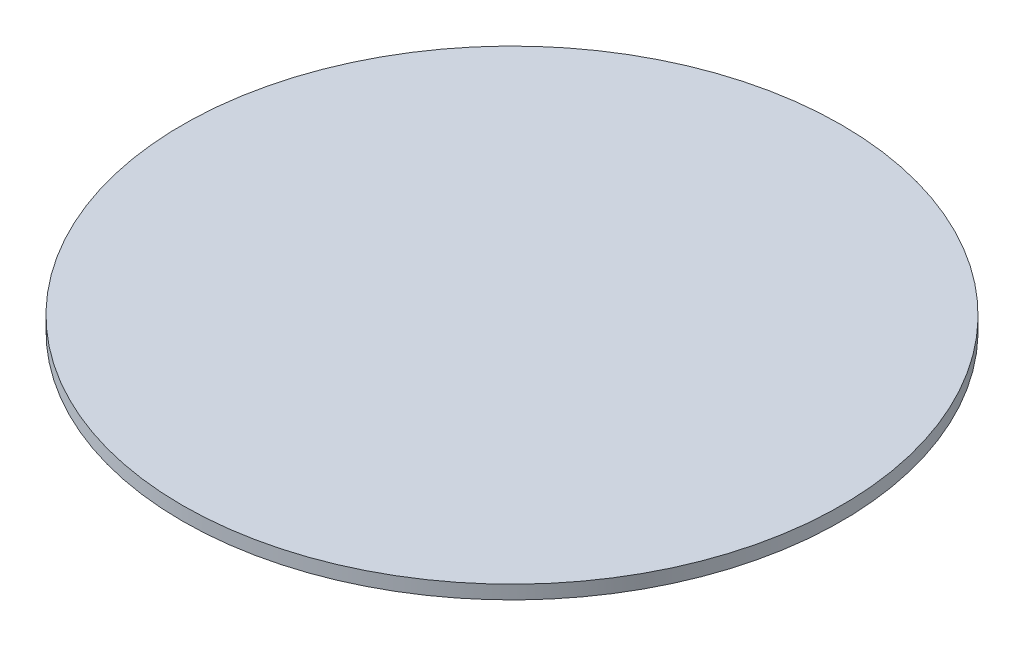
ISO-10303-21;
HEADER;
FILE_DESCRIPTION(('STEP AP214'),'2;1');
FILE_NAME('part.step','',(''),(''),'','','');
FILE_SCHEMA(('AUTOMOTIVE_DESIGN { 1 0 10303 214 1 1 1 1 }'));
ENDSEC;
DATA;
#1=APPLICATION_CONTEXT('core data for automotive mechanical design processes');
#2=APPLICATION_PROTOCOL_DEFINITION('international standard','automotive_design',2000,#1);
#3=PRODUCT_CONTEXT('',#1,'mechanical');
#4=PRODUCT('Part','Part','',(#3));
#5=PRODUCT_RELATED_PRODUCT_CATEGORY('part','',(#4));
#6=PRODUCT_DEFINITION_FORMATION('','',#4);
#7=PRODUCT_DEFINITION_CONTEXT('part definition',#1,'design');
#8=PRODUCT_DEFINITION('design','',#6,#7);
#9=PRODUCT_DEFINITION_SHAPE('','',#8);
#10=(LENGTH_UNIT() NAMED_UNIT(*) SI_UNIT(.MILLI.,.METRE.));
#11=(NAMED_UNIT(*) PLANE_ANGLE_UNIT() SI_UNIT($,.RADIAN.));
#12=(NAMED_UNIT(*) SI_UNIT($,.STERADIAN.) SOLID_ANGLE_UNIT());
#13=UNCERTAINTY_MEASURE_WITH_UNIT(LENGTH_MEASURE(1.E-05),#10,'distance_accuracy_value','');
#14=(GEOMETRIC_REPRESENTATION_CONTEXT(3) GLOBAL_UNCERTAINTY_ASSIGNED_CONTEXT((#13)) GLOBAL_UNIT_ASSIGNED_CONTEXT((#10,
#11,#12)) REPRESENTATION_CONTEXT('',''));
#15=CARTESIAN_POINT('',(0.,0.,0.));
#16=DIRECTION('',(0.,0.,1.));
#17=DIRECTION('',(1.,0.,0.));
#18=AXIS2_PLACEMENT_3D('',#15,#16,#17);
#19=CARTESIAN_POINT('',(0.,0.6,0.));
#20=DIRECTION('',(0.,-1.,0.));
#21=DIRECTION('',(0.,0.,-1.));
#22=AXIS2_PLACEMENT_3D('',#19,#20,#21);
#23=CYLINDRICAL_SURFACE('',#22,14.5);
#24=CARTESIAN_POINT('',(0.,0.6,0.));
#25=DIRECTION('',(0.,1.,0.));
#26=DIRECTION('',(0.,0.,1.));
#27=AXIS2_PLACEMENT_3D('',#24,#25,#26);
#28=CIRCLE('',#27,14.5);
#29=CARTESIAN_POINT('',(0.,0.6,14.5));
#30=VERTEX_POINT('',#29);
#31=EDGE_CURVE('E10',#30,#30,#28,.T.);
#32=ORIENTED_EDGE('',*,*,#31,.F.);
#33=EDGE_LOOP('',(#32));
#34=FACE_BOUND('',#33,.T.);
#35=CARTESIAN_POINT('',(0.,0.,0.));
#36=DIRECTION('',(0.,1.,0.));
#37=DIRECTION('',(0.,0.,1.));
#38=AXIS2_PLACEMENT_3D('',#35,#36,#37);
#39=CIRCLE('',#38,14.5);
#40=CARTESIAN_POINT('',(0.,0.,14.5));
#41=VERTEX_POINT('',#40);
#42=EDGE_CURVE('E34',#41,#41,#39,.T.);
#43=ORIENTED_EDGE('',*,*,#42,.T.);
#44=EDGE_LOOP('',(#43));
#45=FACE_BOUND('',#44,.T.);
#46=ADVANCED_FACE('F31',(#34,#45),#23,.T.);
#47=CARTESIAN_POINT('',(0.,0.6,0.));
#48=DIRECTION('',(0.,1.,0.));
#49=DIRECTION('',(0.,0.,1.));
#50=AXIS2_PLACEMENT_3D('',#47,#48,#49);
#51=PLANE('',#50);
#52=ORIENTED_EDGE('',*,*,#31,.T.);
#53=EDGE_LOOP('',(#52));
#54=FACE_BOUND('',#53,.T.);
#55=ADVANCED_FACE('F46',(#54),#51,.T.);
#56=CARTESIAN_POINT('',(0.,0.,0.));
#57=DIRECTION('',(0.,1.,0.));
#58=DIRECTION('',(0.,0.,1.));
#59=AXIS2_PLACEMENT_3D('',#56,#57,#58);
#60=PLANE('',#59);
#61=ORIENTED_EDGE('',*,*,#42,.F.);
#62=EDGE_LOOP('',(#61));
#63=FACE_BOUND('',#62,.T.);
#64=ADVANCED_FACE('F44',(#63),#60,.F.);
#65=CLOSED_SHELL('',(#46,#55,#64));
#66=MANIFOLD_SOLID_BREP('B2',#65);
#67=ADVANCED_BREP_SHAPE_REPRESENTATION('',(#18,#66),#14);
#68=SHAPE_DEFINITION_REPRESENTATION(#9,#67);
ENDSEC;
END-ISO-10303-21;
